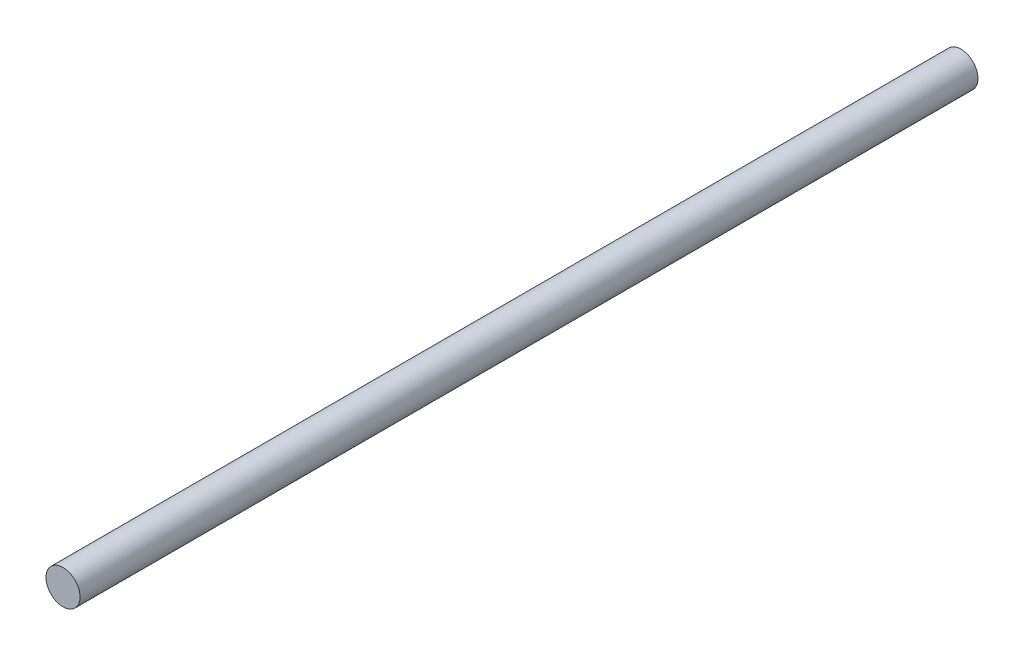
ISO-10303-21;
HEADER;
FILE_DESCRIPTION(('STEP AP214'),'2;1');
FILE_NAME('part.step','',(''),(''),'','','');
FILE_SCHEMA(('AUTOMOTIVE_DESIGN { 1 0 10303 214 1 1 1 1 }'));
ENDSEC;
DATA;
#1=APPLICATION_CONTEXT('core data for automotive mechanical design processes');
#2=APPLICATION_PROTOCOL_DEFINITION('international standard','automotive_design',2000,#1);
#3=PRODUCT_CONTEXT('',#1,'mechanical');
#4=PRODUCT('Part','Part','',(#3));
#5=PRODUCT_RELATED_PRODUCT_CATEGORY('part','',(#4));
#6=PRODUCT_DEFINITION_FORMATION('','',#4);
#7=PRODUCT_DEFINITION_CONTEXT('part definition',#1,'design');
#8=PRODUCT_DEFINITION('design','',#6,#7);
#9=PRODUCT_DEFINITION_SHAPE('','',#8);
#10=(LENGTH_UNIT() NAMED_UNIT(*) SI_UNIT(.MILLI.,.METRE.));
#11=(NAMED_UNIT(*) PLANE_ANGLE_UNIT() SI_UNIT($,.RADIAN.));
#12=(NAMED_UNIT(*) SI_UNIT($,.STERADIAN.) SOLID_ANGLE_UNIT());
#13=UNCERTAINTY_MEASURE_WITH_UNIT(LENGTH_MEASURE(1.E-05),#10,'distance_accuracy_value','');
#14=(GEOMETRIC_REPRESENTATION_CONTEXT(3) GLOBAL_UNCERTAINTY_ASSIGNED_CONTEXT((#13)) GLOBAL_UNIT_ASSIGNED_CONTEXT((#10,
#11,#12)) REPRESENTATION_CONTEXT('',''));
#15=CARTESIAN_POINT('',(0.,0.,0.));
#16=DIRECTION('',(0.,0.,1.));
#17=DIRECTION('',(1.,0.,0.));
#18=AXIS2_PLACEMENT_3D('',#15,#16,#17);
#19=CARTESIAN_POINT('',(0.,0.,-49.));
#20=DIRECTION('',(0.,0.,1.));
#21=DIRECTION('',(1.,0.,0.));
#22=AXIS2_PLACEMENT_3D('',#19,#20,#21);
#23=CYLINDRICAL_SURFACE('',#22,1.5);
#24=CARTESIAN_POINT('',(0.,0.,-49.));
#25=DIRECTION('',(0.,0.,1.));
#26=DIRECTION('',(1.,0.,0.));
#27=AXIS2_PLACEMENT_3D('',#24,#25,#26);
#28=CIRCLE('',#27,1.5);
#29=CARTESIAN_POINT('',(1.5,0.,-49.));
#30=VERTEX_POINT('',#29);
#31=EDGE_CURVE('E10',#30,#30,#28,.T.);
#32=ORIENTED_EDGE('',*,*,#31,.T.);
#33=EDGE_LOOP('',(#32));
#34=FACE_BOUND('',#33,.T.);
#35=CARTESIAN_POINT('',(0.,0.,30.));
#36=DIRECTION('',(0.,0.,1.));
#37=DIRECTION('',(1.,0.,0.));
#38=AXIS2_PLACEMENT_3D('',#35,#36,#37);
#39=CIRCLE('',#38,1.5);
#40=CARTESIAN_POINT('',(1.5,0.,30.));
#41=VERTEX_POINT('',#40);
#42=EDGE_CURVE('E37',#41,#41,#39,.T.);
#43=ORIENTED_EDGE('',*,*,#42,.F.);
#44=EDGE_LOOP('',(#43));
#45=FACE_BOUND('',#44,.T.);
#46=ADVANCED_FACE('F31',(#34,#45),#23,.T.);
#47=CARTESIAN_POINT('',(0.,0.,-49.));
#48=DIRECTION('',(0.,0.,1.));
#49=DIRECTION('',(1.,0.,0.));
#50=AXIS2_PLACEMENT_3D('',#47,#48,#49);
#51=PLANE('',#50);
#52=ORIENTED_EDGE('',*,*,#31,.F.);
#53=EDGE_LOOP('',(#52));
#54=FACE_BOUND('',#53,.T.);
#55=ADVANCED_FACE('F46',(#54),#51,.F.);
#56=CARTESIAN_POINT('',(0.,0.,30.));
#57=DIRECTION('',(0.,0.,1.));
#58=DIRECTION('',(1.,0.,0.));
#59=AXIS2_PLACEMENT_3D('',#56,#57,#58);
#60=PLANE('',#59);
#61=ORIENTED_EDGE('',*,*,#42,.T.);
#62=EDGE_LOOP('',(#61));
#63=FACE_BOUND('',#62,.T.);
#64=ADVANCED_FACE('F43',(#63),#60,.T.);
#65=CLOSED_SHELL('',(#46,#55,#64));
#66=MANIFOLD_SOLID_BREP('B2',#65);
#67=ADVANCED_BREP_SHAPE_REPRESENTATION('',(#18,#66),#14);
#68=SHAPE_DEFINITION_REPRESENTATION(#9,#67);
ENDSEC;
END-ISO-10303-21;
